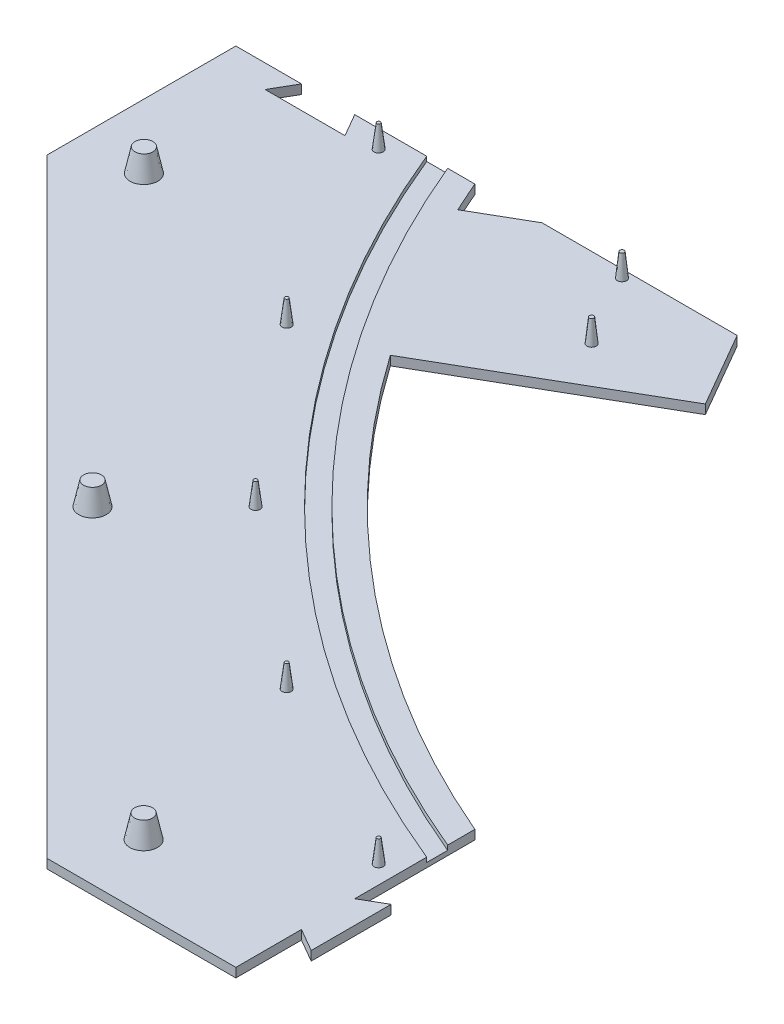
ISO-10303-21;
HEADER;
FILE_DESCRIPTION(('STEP AP214'),'2;1');
FILE_NAME('part.step','',(''),(''),'','','');
FILE_SCHEMA(('AUTOMOTIVE_DESIGN { 1 0 10303 214 1 1 1 1 }'));
ENDSEC;
DATA;
#1=APPLICATION_CONTEXT('core data for automotive mechanical design processes');
#2=APPLICATION_PROTOCOL_DEFINITION('international standard','automotive_design',2000,#1);
#3=PRODUCT_CONTEXT('',#1,'mechanical');
#4=PRODUCT('Part','Part','',(#3));
#5=PRODUCT_RELATED_PRODUCT_CATEGORY('part','',(#4));
#6=PRODUCT_DEFINITION_FORMATION('','',#4);
#7=PRODUCT_DEFINITION_CONTEXT('part definition',#1,'design');
#8=PRODUCT_DEFINITION('design','',#6,#7);
#9=PRODUCT_DEFINITION_SHAPE('','',#8);
#10=(LENGTH_UNIT() NAMED_UNIT(*) SI_UNIT(.MILLI.,.METRE.));
#11=(NAMED_UNIT(*) PLANE_ANGLE_UNIT() SI_UNIT($,.RADIAN.));
#12=(NAMED_UNIT(*) SI_UNIT($,.STERADIAN.) SOLID_ANGLE_UNIT());
#13=UNCERTAINTY_MEASURE_WITH_UNIT(LENGTH_MEASURE(1.E-05),#10,'distance_accuracy_value','');
#14=(GEOMETRIC_REPRESENTATION_CONTEXT(3) GLOBAL_UNCERTAINTY_ASSIGNED_CONTEXT((#13)) GLOBAL_UNIT_ASSIGNED_CONTEXT((#10,
#11,#12)) REPRESENTATION_CONTEXT('',''));
#15=CARTESIAN_POINT('',(0.,0.,0.));
#16=DIRECTION('',(0.,0.,1.));
#17=DIRECTION('',(1.,0.,0.));
#18=AXIS2_PLACEMENT_3D('',#15,#16,#17);
#19=CARTESIAN_POINT('',(0.,0.,0.));
#20=DIRECTION('',(0.,1.,0.));
#21=DIRECTION('',(0.,0.,1.));
#22=AXIS2_PLACEMENT_3D('',#19,#20,#21);
#23=PLANE('',#22);
#24=CARTESIAN_POINT('',(-169.571106160673,0.,108.294228634058));
#25=DIRECTION('',(0.,1.,0.));
#26=DIRECTION('',(0.866025403784443,0.,-0.499999999999992));
#27=AXIS2_PLACEMENT_3D('',#24,#25,#26);
#28=CIRCLE('',#27,1.);
#29=CARTESIAN_POINT('',(-168.705080756889,0.,107.794228634058));
#30=VERTEX_POINT('',#29);
#31=EDGE_CURVE('E317',#30,#30,#28,.T.);
#32=ORIENTED_EDGE('',*,*,#31,.F.);
#33=EDGE_LOOP('',(#32));
#34=FACE_BOUND('',#33,.T.);
#35=CARTESIAN_POINT('',(-178.571106160673,0.,92.7057713659384));
#36=DIRECTION('',(0.,1.,0.));
#37=DIRECTION('',(0.866025403784443,0.,-0.499999999999992));
#38=AXIS2_PLACEMENT_3D('',#35,#36,#37);
#39=CIRCLE('',#38,1.);
#40=CARTESIAN_POINT('',(-177.705080756889,0.,92.2057713659384));
#41=VERTEX_POINT('',#40);
#42=EDGE_CURVE('E309',#41,#41,#39,.T.);
#43=ORIENTED_EDGE('',*,*,#42,.F.);
#44=EDGE_LOOP('',(#43));
#45=FACE_BOUND('',#44,.T.);
#46=DIRECTION('',(-1.,0.,0.));
#47=VECTOR('',#46,1.);
#48=CARTESIAN_POINT('',(0.,0.,91.));
#49=LINE('',#48,#47);
#50=CARTESIAN_POINT('',(-212.176813059297,0.,91.));
#51=VERTEX_POINT('',#50);
#52=CARTESIAN_POINT('',(-218.074964175166,0.,91.));
#53=VERTEX_POINT('',#52);
#54=EDGE_CURVE('E411',#51,#53,#49,.T.);
#55=ORIENTED_EDGE('',*,*,#54,.T.);
#56=CARTESIAN_POINT('',(0.,0.,0.));
#57=DIRECTION('',(0.,1.,0.));
#58=DIRECTION('',(0.,0.,1.));
#59=AXIS2_PLACEMENT_3D('',#56,#57,#58);
#60=CIRCLE('',#59,236.3);
#61=CARTESIAN_POINT('',(-91.,0.,218.074964175166));
#62=VERTEX_POINT('',#61);
#63=EDGE_CURVE('E52',#53,#62,#60,.T.);
#64=ORIENTED_EDGE('',*,*,#63,.T.);
#65=DIRECTION('',(0.,0.,-1.));
#66=VECTOR('',#65,1.);
#67=CARTESIAN_POINT('',(-91.,0.,0.));
#68=LINE('',#67,#66);
#69=CARTESIAN_POINT('',(-91.,0.,212.176813059297));
#70=VERTEX_POINT('',#69);
#71=EDGE_CURVE('E396',#62,#70,#68,.T.);
#72=ORIENTED_EDGE('',*,*,#71,.T.);
#73=CARTESIAN_POINT('',(0.,0.,0.));
#74=DIRECTION('',(0.,1.,0.));
#75=DIRECTION('',(0.,0.,1.));
#76=AXIS2_PLACEMENT_3D('',#73,#74,#75);
#77=CIRCLE('',#76,230.867927612304);
#78=CARTESIAN_POINT('',(-189.185842870419,0.,132.320508075691));
#79=VERTEX_POINT('',#78);
#80=EDGE_CURVE('E346',#70,#79,#77,.F.);
#81=ORIENTED_EDGE('',*,*,#80,.T.);
#82=DIRECTION('',(0.866025403784433,0.,-0.50000000000001));
#83=VECTOR('',#82,1.);
#84=CARTESIAN_POINT('',(10.0000000000002,0.,17.3205080756886));
#85=LINE('',#84,#83);
#86=CARTESIAN_POINT('',(-145.884572681198,0.,107.32050807569));
#87=VERTEX_POINT('',#86);
#88=EDGE_CURVE('E369',#79,#87,#85,.T.);
#89=ORIENTED_EDGE('',*,*,#88,.T.);
#90=DIRECTION('',(-0.50000000000001,0.,-0.866025403784433));
#91=VECTOR('',#90,1.);
#92=CARTESIAN_POINT('',(-155.884572681198,0.,90.0000000000018));
#93=LINE('',#92,#91);
#94=CARTESIAN_POINT('',(-155.307222412009,0.,91.));
#95=VERTEX_POINT('',#94);
#96=EDGE_CURVE('E374',#87,#95,#93,.T.);
#97=ORIENTED_EDGE('',*,*,#96,.T.);
#98=CARTESIAN_POINT('',(-197.616623488763,0.,91.));
#99=VERTEX_POINT('',#98);
#100=EDGE_CURVE('E406',#95,#99,#49,.T.);
#101=ORIENTED_EDGE('',*,*,#100,.T.);
#102=DIRECTION('',(0.866025403784433,0.,-0.50000000000001));
#103=VECTOR('',#102,1.);
#104=CARTESIAN_POINT('',(-10.0000000000002,0.,-17.3205080756886));
#105=LINE('',#104,#103);
#106=CARTESIAN_POINT('',(-209.18584287042,0.,97.6794919243137));
#107=VERTEX_POINT('',#106);
#108=EDGE_CURVE('E378',#107,#99,#105,.T.);
#109=ORIENTED_EDGE('',*,*,#108,.F.);
#110=CARTESIAN_POINT('',(0.,0.,0.));
#111=DIRECTION('',(0.,1.,0.));
#112=DIRECTION('',(-0.866025403784443,0.,-0.499999999999992));
#113=AXIS2_PLACEMENT_3D('',#110,#111,#112);
#114=CIRCLE('',#113,230.867927612304);
#115=EDGE_CURVE('E352',#51,#107,#114,.T.);
#116=ORIENTED_EDGE('',*,*,#115,.F.);
#117=EDGE_LOOP('',(#55,#64,#72,#81,#89,#97,#101,#109,#116));
#118=FACE_BOUND('',#117,.T.);
#119=ADVANCED_FACE('F36',(#34,#45,#118),#23,.T.);
#120=CARTESIAN_POINT('',(-91.,8.,91.));
#121=DIRECTION('',(0.,0.,-1.));
#122=DIRECTION('',(-1.,0.,0.));
#123=AXIS2_PLACEMENT_3D('',#120,#121,#122);
#124=PLANE('',#123);
#125=DIRECTION('',(0.,1.,0.));
#126=VECTOR('',#125,1.);
#127=CARTESIAN_POINT('',(-249.773502691896,8.,91.));
#128=LINE('',#127,#126);
#129=CARTESIAN_POINT('',(-249.773502691896,-2.,90.9999999999999));
#130=VERTEX_POINT('',#129);
#131=CARTESIAN_POINT('',(-249.773502691896,0.,90.9999999999999));
#132=VERTEX_POINT('',#131);
#133=EDGE_CURVE('E200',#130,#132,#128,.T.);
#134=ORIENTED_EDGE('',*,*,#133,.F.);
#135=DIRECTION('',(1.,0.,0.));
#136=VECTOR('',#135,1.);
#137=CARTESIAN_POINT('',(-91.,-2.,91.));
#138=LINE('',#137,#136);
#139=CARTESIAN_POINT('',(-264.,-2.,91.));
#140=VERTEX_POINT('',#139);
#141=EDGE_CURVE('E416',#140,#130,#138,.T.);
#142=ORIENTED_EDGE('',*,*,#141,.F.);
#143=DIRECTION('',(0.,-1.,0.));
#144=VECTOR('',#143,1.);
#145=CARTESIAN_POINT('',(-264.,8.,91.));
#146=LINE('',#145,#144);
#147=CARTESIAN_POINT('',(-264.,0.,91.));
#148=VERTEX_POINT('',#147);
#149=EDGE_CURVE('E410',#148,#140,#146,.T.);
#150=ORIENTED_EDGE('',*,*,#149,.F.);
#151=EDGE_CURVE('E401',#132,#148,#49,.T.);
#152=ORIENTED_EDGE('',*,*,#151,.F.);
#153=EDGE_LOOP('',(#134,#142,#150,#152));
#154=FACE_BOUND('',#153,.T.);
#155=ADVANCED_FACE('F523',(#154),#124,.T.);
#156=CARTESIAN_POINT('',(-91.,8.,91.));
#157=DIRECTION('',(1.,0.,0.));
#158=DIRECTION('',(0.,0.,-1.));
#159=AXIS2_PLACEMENT_3D('',#156,#157,#158);
#160=PLANE('',#159);
#161=DIRECTION('',(0.,1.,0.));
#162=VECTOR('',#161,1.);
#163=CARTESIAN_POINT('',(-91.,-1.,222.619069264068));
#164=LINE('',#163,#162);
#165=CARTESIAN_POINT('',(-91.,0.,222.619069264068));
#166=VERTEX_POINT('',#165);
#167=CARTESIAN_POINT('',(-91.,-1.,222.619069264068));
#168=VERTEX_POINT('',#167);
#169=EDGE_CURVE('E476',#166,#168,#164,.F.);
#170=ORIENTED_EDGE('',*,*,#169,.F.);
#171=CARTESIAN_POINT('',(-91.,0.,238.226497308104));
#172=VERTEX_POINT('',#171);
#173=EDGE_CURVE('E395',#172,#166,#68,.T.);
#174=ORIENTED_EDGE('',*,*,#173,.F.);
#175=DIRECTION('',(0.,1.,0.));
#176=VECTOR('',#175,1.);
#177=CARTESIAN_POINT('',(-91.,8.,238.226497308104));
#178=LINE('',#177,#176);
#179=CARTESIAN_POINT('',(-91.,-2.,238.226497308104));
#180=VERTEX_POINT('',#179);
#181=EDGE_CURVE('E222',#180,#172,#178,.T.);
#182=ORIENTED_EDGE('',*,*,#181,.F.);
#183=DIRECTION('',(0.,0.,1.));
#184=VECTOR('',#183,1.);
#185=CARTESIAN_POINT('',(-91.,-2.,91.));
#186=LINE('',#185,#184);
#187=CARTESIAN_POINT('',(-91.,-2.,212.176813059297));
#188=VERTEX_POINT('',#187);
#189=EDGE_CURVE('E425',#188,#180,#186,.T.);
#190=ORIENTED_EDGE('',*,*,#189,.F.);
#191=DIRECTION('',(0.,1.,0.));
#192=VECTOR('',#191,1.);
#193=CARTESIAN_POINT('',(-91.,-2.,212.176813059297));
#194=LINE('',#193,#192);
#195=EDGE_CURVE('E229',#70,#188,#194,.F.);
#196=ORIENTED_EDGE('',*,*,#195,.F.);
#197=ORIENTED_EDGE('',*,*,#71,.F.);
#198=DIRECTION('',(0.,1.,0.));
#199=VECTOR('',#198,1.);
#200=CARTESIAN_POINT('',(-91.,-1.,218.074964175166));
#201=LINE('',#200,#199);
#202=CARTESIAN_POINT('',(-91.,-1.,218.074964175166));
#203=VERTEX_POINT('',#202);
#204=EDGE_CURVE('E491',#62,#203,#201,.F.);
#205=ORIENTED_EDGE('',*,*,#204,.T.);
#206=DIRECTION('',(0.,0.,1.));
#207=VECTOR('',#206,1.);
#208=CARTESIAN_POINT('',(-91.,-1.,91.));
#209=LINE('',#208,#207);
#210=EDGE_CURVE('E207',#203,#168,#209,.T.);
#211=ORIENTED_EDGE('',*,*,#210,.T.);
#212=EDGE_LOOP('',(#170,#174,#182,#190,#196,#197,#205,#211));
#213=FACE_BOUND('',#212,.T.);
#214=ADVANCED_FACE('F507',(#213),#160,.T.);
#215=CARTESIAN_POINT('',(0.,-2.,0.));
#216=DIRECTION('',(0.,1.,0.));
#217=DIRECTION('',(0.,0.,1.));
#218=AXIS2_PLACEMENT_3D('',#215,#216,#217);
#219=PLANE('',#218);
#220=ORIENTED_EDGE('',*,*,#141,.T.);
#221=DIRECTION('',(-0.5,0.,0.866025403784438));
#222=VECTOR('',#221,1.);
#223=CARTESIAN_POINT('',(-244.,-2.,81.));
#224=LINE('',#223,#222);
#225=CARTESIAN_POINT('',(-252.660254037844,-2.,96.));
#226=VERTEX_POINT('',#225);
#227=EDGE_CURVE('E468',#130,#226,#224,.T.);
#228=ORIENTED_EDGE('',*,*,#227,.T.);
#229=DIRECTION('',(1.,0.,0.));
#230=VECTOR('',#229,1.);
#231=CARTESIAN_POINT('',(-252.660254037844,-2.,96.));
#232=LINE('',#231,#230);
#233=CARTESIAN_POINT('',(-235.339745962156,-2.,96.));
#234=VERTEX_POINT('',#233);
#235=EDGE_CURVE('E480',#226,#234,#232,.T.);
#236=ORIENTED_EDGE('',*,*,#235,.T.);
#237=DIRECTION('',(-0.5,0.,-0.866025403784438));
#238=VECTOR('',#237,1.);
#239=CARTESIAN_POINT('',(-235.339745962156,-2.,96.));
#240=LINE('',#239,#238);
#241=CARTESIAN_POINT('',(-238.226497308104,-2.,90.9999999999999));
#242=VERTEX_POINT('',#241);
#243=EDGE_CURVE('E462',#234,#242,#240,.T.);
#244=ORIENTED_EDGE('',*,*,#243,.T.);
#245=CARTESIAN_POINT('',(-212.176813059297,-2.,91.));
#246=VERTEX_POINT('',#245);
#247=EDGE_CURVE('E423',#242,#246,#138,.T.);
#248=ORIENTED_EDGE('',*,*,#247,.T.);
#249=CARTESIAN_POINT('',(0.,-2.,0.));
#250=DIRECTION('',(0.,1.,0.));
#251=DIRECTION('',(-0.866025403784443,0.,-0.499999999999992));
#252=AXIS2_PLACEMENT_3D('',#249,#250,#251);
#253=CIRCLE('',#252,230.867927612304);
#254=CARTESIAN_POINT('',(-209.18584287042,-2.,97.6794919243137));
#255=VERTEX_POINT('',#254);
#256=EDGE_CURVE('E349',#246,#255,#253,.T.);
#257=ORIENTED_EDGE('',*,*,#256,.T.);
#258=DIRECTION('',(0.866025403784433,0.,-0.50000000000001));
#259=VECTOR('',#258,1.);
#260=CARTESIAN_POINT('',(-10.0000000000002,-2.,-17.3205080756886));
#261=LINE('',#260,#259);
#262=CARTESIAN_POINT('',(-197.616623488763,-2.,91.));
#263=VERTEX_POINT('',#262);
#264=EDGE_CURVE('E373',#255,#263,#261,.T.);
#265=ORIENTED_EDGE('',*,*,#264,.T.);
#266=CARTESIAN_POINT('',(-155.307222412009,-2.,91.));
#267=VERTEX_POINT('',#266);
#268=EDGE_CURVE('E424',#263,#267,#138,.T.);
#269=ORIENTED_EDGE('',*,*,#268,.T.);
#270=DIRECTION('',(-0.50000000000001,0.,-0.866025403784433));
#271=VECTOR('',#270,1.);
#272=CARTESIAN_POINT('',(-155.884572681198,-2.,90.0000000000018));
#273=LINE('',#272,#271);
#274=CARTESIAN_POINT('',(-145.884572681198,-2.,107.32050807569));
#275=VERTEX_POINT('',#274);
#276=EDGE_CURVE('E385',#275,#267,#273,.T.);
#277=ORIENTED_EDGE('',*,*,#276,.F.);
#278=DIRECTION('',(0.866025403784433,0.,-0.50000000000001));
#279=VECTOR('',#278,1.);
#280=CARTESIAN_POINT('',(10.0000000000002,-2.,17.3205080756886));
#281=LINE('',#280,#279);
#282=CARTESIAN_POINT('',(-189.185842870419,-2.,132.320508075691));
#283=VERTEX_POINT('',#282);
#284=EDGE_CURVE('E363',#283,#275,#281,.T.);
#285=ORIENTED_EDGE('',*,*,#284,.F.);
#286=CARTESIAN_POINT('',(0.,-2.,0.));
#287=DIRECTION('',(0.,1.,0.));
#288=DIRECTION('',(0.,0.,1.));
#289=AXIS2_PLACEMENT_3D('',#286,#287,#288);
#290=CIRCLE('',#289,230.867927612304);
#291=EDGE_CURVE('E345',#188,#283,#290,.F.);
#292=ORIENTED_EDGE('',*,*,#291,.F.);
#293=ORIENTED_EDGE('',*,*,#189,.T.);
#294=DIRECTION('',(0.866025403784439,0.,-0.5));
#295=VECTOR('',#294,1.);
#296=CARTESIAN_POINT('',(-86.,-2.,235.339745962156));
#297=LINE('',#296,#295);
#298=CARTESIAN_POINT('',(-86.,-2.,235.339745962156));
#299=VERTEX_POINT('',#298);
#300=EDGE_CURVE('E433',#180,#299,#297,.T.);
#301=ORIENTED_EDGE('',*,*,#300,.T.);
#302=DIRECTION('',(0.,0.,1.));
#303=VECTOR('',#302,1.);
#304=CARTESIAN_POINT('',(-86.,-2.,252.660254037844));
#305=LINE('',#304,#303);
#306=CARTESIAN_POINT('',(-86.,-2.,252.660254037844));
#307=VERTEX_POINT('',#306);
#308=EDGE_CURVE('E442',#299,#307,#305,.T.);
#309=ORIENTED_EDGE('',*,*,#308,.T.);
#310=DIRECTION('',(-0.866025403784438,0.,-0.500000000000001));
#311=VECTOR('',#310,1.);
#312=CARTESIAN_POINT('',(-101.,-2.,244.));
#313=LINE('',#312,#311);
#314=CARTESIAN_POINT('',(-91.,-2.,249.773502691896));
#315=VERTEX_POINT('',#314);
#316=EDGE_CURVE('E430',#307,#315,#313,.T.);
#317=ORIENTED_EDGE('',*,*,#316,.T.);
#318=CARTESIAN_POINT('',(-91.,-2.,264.));
#319=VERTEX_POINT('',#318);
#320=EDGE_CURVE('E429',#315,#319,#186,.T.);
#321=ORIENTED_EDGE('',*,*,#320,.T.);
#322=DIRECTION('',(1.,0.,0.));
#323=VECTOR('',#322,1.);
#324=CARTESIAN_POINT('',(-131.979594929244,-2.,264.));
#325=LINE('',#324,#323);
#326=CARTESIAN_POINT('',(-131.979594929244,-2.,264.));
#327=VERTEX_POINT('',#326);
#328=EDGE_CURVE('E241',#327,#319,#325,.T.);
#329=ORIENTED_EDGE('',*,*,#328,.F.);
#330=DIRECTION('',(0.707107865975289,0.,0.707105696396142));
#331=VECTOR('',#330,1.);
#332=CARTESIAN_POINT('',(-131.979594929244,-2.,264.));
#333=LINE('',#332,#331);
#334=CARTESIAN_POINT('',(-264.,-2.,131.98));
#335=VERTEX_POINT('',#334);
#336=EDGE_CURVE('E261',#335,#327,#333,.T.);
#337=ORIENTED_EDGE('',*,*,#336,.F.);
#338=DIRECTION('',(0.,0.,1.));
#339=VECTOR('',#338,1.);
#340=CARTESIAN_POINT('',(-264.,-2.,-131.979594929244));
#341=LINE('',#340,#339);
#342=EDGE_CURVE('E249',#140,#335,#341,.T.);
#343=ORIENTED_EDGE('',*,*,#342,.F.);
#344=EDGE_LOOP('',(#220,#228,#236,#244,#248,#257,#265,#269,#277,#285,#292,#293,#301,#309,#317,
#321,#329,#337,#343));
#345=FACE_BOUND('',#344,.T.);
#346=ADVANCED_FACE('F555',(#345),#219,.F.);
#347=CARTESIAN_POINT('',(0.,0.,0.));
#348=DIRECTION('',(0.,1.,0.));
#349=DIRECTION('',(0.,0.,1.));
#350=AXIS2_PLACEMENT_3D('',#347,#348,#349);
#351=CIRCLE('',#350,240.5);
#352=CARTESIAN_POINT('',(-222.619069264068,0.,91.));
#353=VERTEX_POINT('',#352);
#354=EDGE_CURVE('E209',#353,#166,#351,.T.);
#355=ORIENTED_EDGE('',*,*,#354,.F.);
#356=CARTESIAN_POINT('',(-238.226497308104,0.,91.));
#357=VERTEX_POINT('',#356);
#358=EDGE_CURVE('E60',#353,#357,#49,.T.);
#359=ORIENTED_EDGE('',*,*,#358,.T.);
#360=DIRECTION('',(-0.5,0.,-0.866025403784438));
#361=VECTOR('',#360,1.);
#362=CARTESIAN_POINT('',(-235.339745962156,0.,96.));
#363=LINE('',#362,#361);
#364=CARTESIAN_POINT('',(-235.339745962156,0.,96.));
#365=VERTEX_POINT('',#364);
#366=EDGE_CURVE('E465',#365,#357,#363,.T.);
#367=ORIENTED_EDGE('',*,*,#366,.F.);
#368=DIRECTION('',(1.,0.,0.));
#369=VECTOR('',#368,1.);
#370=CARTESIAN_POINT('',(-252.660254037844,0.,96.));
#371=LINE('',#370,#369);
#372=CARTESIAN_POINT('',(-252.660254037844,0.,96.));
#373=VERTEX_POINT('',#372);
#374=EDGE_CURVE('E469',#373,#365,#371,.T.);
#375=ORIENTED_EDGE('',*,*,#374,.F.);
#376=DIRECTION('',(-0.5,0.,0.866025403784438));
#377=VECTOR('',#376,1.);
#378=CARTESIAN_POINT('',(-244.,0.,81.));
#379=LINE('',#378,#377);
#380=EDGE_CURVE('E473',#132,#373,#379,.T.);
#381=ORIENTED_EDGE('',*,*,#380,.F.);
#382=ORIENTED_EDGE('',*,*,#151,.T.);
#383=DIRECTION('',(0.,0.,1.));
#384=VECTOR('',#383,1.);
#385=CARTESIAN_POINT('',(-264.,0.,0.));
#386=LINE('',#385,#384);
#387=CARTESIAN_POINT('',(-264.,0.,131.98));
#388=VERTEX_POINT('',#387);
#389=EDGE_CURVE('E254',#148,#388,#386,.T.);
#390=ORIENTED_EDGE('',*,*,#389,.T.);
#391=DIRECTION('',(0.707107865975289,0.,0.707105696396142));
#392=VECTOR('',#391,1.);
#393=CARTESIAN_POINT('',(-131.979594929244,0.,264.));
#394=LINE('',#393,#392);
#395=CARTESIAN_POINT('',(-131.979594929244,0.,264.));
#396=VERTEX_POINT('',#395);
#397=EDGE_CURVE('E250',#388,#396,#394,.T.);
#398=ORIENTED_EDGE('',*,*,#397,.T.);
#399=DIRECTION('',(1.,0.,0.));
#400=VECTOR('',#399,1.);
#401=CARTESIAN_POINT('',(0.,0.,264.));
#402=LINE('',#401,#400);
#403=CARTESIAN_POINT('',(-91.,0.,264.));
#404=VERTEX_POINT('',#403);
#405=EDGE_CURVE('E245',#396,#404,#402,.T.);
#406=ORIENTED_EDGE('',*,*,#405,.T.);
#407=CARTESIAN_POINT('',(-91.,0.,249.773502691896));
#408=VERTEX_POINT('',#407);
#409=EDGE_CURVE('E382',#404,#408,#68,.T.);
#410=ORIENTED_EDGE('',*,*,#409,.T.);
#411=DIRECTION('',(0.866025403784438,0.,0.500000000000001));
#412=VECTOR('',#411,1.);
#413=CARTESIAN_POINT('',(-101.,0.,244.));
#414=LINE('',#413,#412);
#415=CARTESIAN_POINT('',(-86.,0.,252.660254037844));
#416=VERTEX_POINT('',#415);
#417=EDGE_CURVE('E446',#408,#416,#414,.T.);
#418=ORIENTED_EDGE('',*,*,#417,.T.);
#419=DIRECTION('',(0.,0.,-1.));
#420=VECTOR('',#419,1.);
#421=CARTESIAN_POINT('',(-86.,0.,252.660254037844));
#422=LINE('',#421,#420);
#423=CARTESIAN_POINT('',(-86.,0.,235.339745962156));
#424=VERTEX_POINT('',#423);
#425=EDGE_CURVE('E439',#416,#424,#422,.T.);
#426=ORIENTED_EDGE('',*,*,#425,.T.);
#427=DIRECTION('',(-0.866025403784439,0.,0.5));
#428=VECTOR('',#427,1.);
#429=CARTESIAN_POINT('',(-86.,0.,235.339745962156));
#430=LINE('',#429,#428);
#431=EDGE_CURVE('E449',#424,#172,#430,.T.);
#432=ORIENTED_EDGE('',*,*,#431,.T.);
#433=ORIENTED_EDGE('',*,*,#173,.T.);
#434=EDGE_LOOP('',(#355,#359,#367,#375,#381,#382,#390,#398,#406,#410,#418,#426,#432,#433));
#435=FACE_BOUND('',#434,.T.);
#436=CARTESIAN_POINT('',(-94.905491226544,0.,229.122124062798));
#437=DIRECTION('',(0.,1.,0.));
#438=DIRECTION('',(0.382683432365097,0.,-0.923879532511284));
#439=AXIS2_PLACEMENT_3D('',#436,#437,#438);
#440=CIRCLE('',#439,1.);
#441=CARTESIAN_POINT('',(-94.5228077941789,0.,228.198244530287));
#442=VERTEX_POINT('',#441);
#443=EDGE_CURVE('E270',#442,#442,#440,.T.);
#444=ORIENTED_EDGE('',*,*,#443,.F.);
#445=EDGE_LOOP('',(#444));
#446=FACE_BOUND('',#445,.T.);
#447=CARTESIAN_POINT('',(-137.781417788863,0.,206.20446385103));
#448=DIRECTION('',(0.,1.,0.));
#449=DIRECTION('',(0.555570233019609,0.,-0.831469612302541));
#450=AXIS2_PLACEMENT_3D('',#447,#448,#449);
#451=CIRCLE('',#450,1.);
#452=CARTESIAN_POINT('',(-137.225847555843,0.,205.372994238728));
#453=VERTEX_POINT('',#452);
#454=EDGE_CURVE('E278',#453,#453,#451,.T.);
#455=ORIENTED_EDGE('',*,*,#454,.F.);
#456=EDGE_LOOP('',(#455));
#457=FACE_BOUND('',#456,.T.);
#458=CARTESIAN_POINT('',(-175.362481734265,0.,175.362481734262));
#459=DIRECTION('',(0.,1.,0.));
#460=DIRECTION('',(0.707106781186554,0.,-0.707106781186541));
#461=AXIS2_PLACEMENT_3D('',#458,#459,#460);
#462=CIRCLE('',#461,1.);
#463=CARTESIAN_POINT('',(-174.655374953079,0.,174.655374953076));
#464=VERTEX_POINT('',#463);
#465=EDGE_CURVE('E286',#464,#464,#462,.T.);
#466=ORIENTED_EDGE('',*,*,#465,.F.);
#467=EDGE_LOOP('',(#466));
#468=FACE_BOUND('',#467,.T.);
#469=CARTESIAN_POINT('',(-206.204463851032,0.,137.78141778886));
#470=DIRECTION('',(0.,1.,0.));
#471=DIRECTION('',(0.83146961230255,0.,-0.555570233019595));
#472=AXIS2_PLACEMENT_3D('',#469,#470,#471);
#473=CIRCLE('',#472,1.);
#474=CARTESIAN_POINT('',(-205.37299423873,0.,137.22584755584));
#475=VERTEX_POINT('',#474);
#476=EDGE_CURVE('E294',#475,#475,#473,.T.);
#477=ORIENTED_EDGE('',*,*,#476,.F.);
#478=EDGE_LOOP('',(#477));
#479=FACE_BOUND('',#478,.T.);
#480=CARTESIAN_POINT('',(-229.1221240628,0.,94.9054912265401));
#481=DIRECTION('',(0.,1.,0.));
#482=DIRECTION('',(0.923879532511291,0.,-0.382683432365081));
#483=AXIS2_PLACEMENT_3D('',#480,#481,#482);
#484=CIRCLE('',#483,1.);
#485=CARTESIAN_POINT('',(-228.198244530289,0.,94.522807794175));
#486=VERTEX_POINT('',#485);
#487=EDGE_CURVE('E302',#486,#486,#484,.T.);
#488=ORIENTED_EDGE('',*,*,#487,.F.);
#489=EDGE_LOOP('',(#488));
#490=FACE_BOUND('',#489,.T.);
#491=CARTESIAN_POINT('',(-193.04015126393,0.,193.040151263925));
#492=DIRECTION('',(0.,1.,0.));
#493=DIRECTION('',(1.,0.,0.));
#494=AXIS2_PLACEMENT_3D('',#491,#492,#493);
#495=CIRCLE('',#494,2.99999999999999);
#496=CARTESIAN_POINT('',(-190.04015126393,0.,193.040151263925));
#497=VERTEX_POINT('',#496);
#498=EDGE_CURVE('E325',#497,#497,#495,.T.);
#499=ORIENTED_EDGE('',*,*,#498,.F.);
#500=EDGE_LOOP('',(#499));
#501=FACE_BOUND('',#500,.T.);
#502=CARTESIAN_POINT('',(-125.,0.,250.));
#503=DIRECTION('',(0.,1.,0.));
#504=DIRECTION('',(0.,0.,1.));
#505=AXIS2_PLACEMENT_3D('',#502,#503,#504);
#506=CIRCLE('',#505,2.99999999999999);
#507=CARTESIAN_POINT('',(-125.,0.,253.));
#508=VERTEX_POINT('',#507);
#509=EDGE_CURVE('E333',#508,#508,#506,.T.);
#510=ORIENTED_EDGE('',*,*,#509,.F.);
#511=EDGE_LOOP('',(#510));
#512=FACE_BOUND('',#511,.T.);
#513=CARTESIAN_POINT('',(-250.065638642357,0.,124.868636456037));
#514=DIRECTION('',(0.,1.,0.));
#515=DIRECTION('',(-0.600420225325885,0.,0.79968465848709));
#516=AXIS2_PLACEMENT_3D('',#513,#514,#515);
#517=CIRCLE('',#516,2.99999999999999);
#518=CARTESIAN_POINT('',(-251.866899318335,0.,127.267690431498));
#519=VERTEX_POINT('',#518);
#520=EDGE_CURVE('E341',#519,#519,#517,.T.);
#521=ORIENTED_EDGE('',*,*,#520,.F.);
#522=EDGE_LOOP('',(#521));
#523=FACE_BOUND('',#522,.T.);
#524=ADVANCED_FACE('F517',(#435,#446,#457,#468,#479,#490,#501,#512,#523),#23,.T.);
#525=CARTESIAN_POINT('',(0.,-2.,264.));
#526=DIRECTION('',(0.,0.,1.));
#527=DIRECTION('',(1.,0.,0.));
#528=AXIS2_PLACEMENT_3D('',#525,#526,#527);
#529=PLANE('',#528);
#530=ORIENTED_EDGE('',*,*,#328,.T.);
#531=DIRECTION('',(0.,-1.,0.));
#532=VECTOR('',#531,1.);
#533=CARTESIAN_POINT('',(-91.,8.,264.));
#534=LINE('',#533,#532);
#535=EDGE_CURVE('E412',#404,#319,#534,.T.);
#536=ORIENTED_EDGE('',*,*,#535,.F.);
#537=ORIENTED_EDGE('',*,*,#405,.F.);
#538=DIRECTION('',(0.,1.,0.));
#539=VECTOR('',#538,1.);
#540=CARTESIAN_POINT('',(-131.979594929244,-2.,264.));
#541=LINE('',#540,#539);
#542=EDGE_CURVE('E236',#327,#396,#541,.T.);
#543=ORIENTED_EDGE('',*,*,#542,.F.);
#544=EDGE_LOOP('',(#530,#536,#537,#543));
#545=FACE_BOUND('',#544,.T.);
#546=ADVANCED_FACE('F533',(#545),#529,.T.);
#547=CARTESIAN_POINT('',(-264.,-2.,0.));
#548=DIRECTION('',(-1.,0.,0.));
#549=DIRECTION('',(0.,0.,1.));
#550=AXIS2_PLACEMENT_3D('',#547,#548,#549);
#551=PLANE('',#550);
#552=ORIENTED_EDGE('',*,*,#389,.F.);
#553=ORIENTED_EDGE('',*,*,#149,.T.);
#554=ORIENTED_EDGE('',*,*,#342,.T.);
#555=DIRECTION('',(0.,1.,0.));
#556=VECTOR('',#555,1.);
#557=CARTESIAN_POINT('',(-264.,-2.,131.98));
#558=LINE('',#557,#556);
#559=EDGE_CURVE('E237',#335,#388,#558,.T.);
#560=ORIENTED_EDGE('',*,*,#559,.T.);
#561=EDGE_LOOP('',(#552,#553,#554,#560));
#562=FACE_BOUND('',#561,.T.);
#563=ADVANCED_FACE('F38',(#562),#551,.T.);
#564=CARTESIAN_POINT('',(0.,-2.,0.));
#565=DIRECTION('',(0.,1.,0.));
#566=DIRECTION('',(0.,0.,1.));
#567=AXIS2_PLACEMENT_3D('',#564,#565,#566);
#568=CYLINDRICAL_SURFACE('',#567,230.867927612304);
#569=ORIENTED_EDGE('',*,*,#80,.F.);
#570=ORIENTED_EDGE('',*,*,#195,.T.);
#571=ORIENTED_EDGE('',*,*,#291,.T.);
#572=DIRECTION('',(0.,1.,0.));
#573=VECTOR('',#572,1.);
#574=CARTESIAN_POINT('',(-189.185842870419,-2.,132.320508075691));
#575=LINE('',#574,#573);
#576=EDGE_CURVE('E355',#283,#79,#575,.T.);
#577=ORIENTED_EDGE('',*,*,#576,.T.);
#578=EDGE_LOOP('',(#569,#570,#571,#577));
#579=FACE_BOUND('',#578,.T.);
#580=ADVANCED_FACE('F560',(#579),#568,.F.);
#581=CARTESIAN_POINT('',(0.,-2.,0.));
#582=DIRECTION('',(0.,1.,0.));
#583=DIRECTION('',(0.,0.,1.));
#584=AXIS2_PLACEMENT_3D('',#581,#582,#583);
#585=CYLINDRICAL_SURFACE('',#584,230.867927612304);
#586=DIRECTION('',(0.,1.,0.));
#587=VECTOR('',#586,1.);
#588=CARTESIAN_POINT('',(-212.176813059297,-2.,91.));
#589=LINE('',#588,#587);
#590=EDGE_CURVE('E397',#51,#246,#589,.F.);
#591=ORIENTED_EDGE('',*,*,#590,.F.);
#592=ORIENTED_EDGE('',*,*,#115,.T.);
#593=DIRECTION('',(0.,1.,0.));
#594=VECTOR('',#593,1.);
#595=CARTESIAN_POINT('',(-209.18584287042,-2.,97.6794919243137));
#596=LINE('',#595,#594);
#597=EDGE_CURVE('E358',#255,#107,#596,.T.);
#598=ORIENTED_EDGE('',*,*,#597,.F.);
#599=ORIENTED_EDGE('',*,*,#256,.F.);
#600=EDGE_LOOP('',(#591,#592,#598,#599));
#601=FACE_BOUND('',#600,.T.);
#602=ADVANCED_FACE('F582',(#601),#585,.F.);
#603=CARTESIAN_POINT('',(-155.884572681198,-2.,90.0000000000018));
#604=DIRECTION('',(0.866025403784433,0.,-0.50000000000001));
#605=DIRECTION('',(-0.50000000000001,0.,-0.866025403784433));
#606=AXIS2_PLACEMENT_3D('',#603,#604,#605);
#607=PLANE('',#606);
#608=ORIENTED_EDGE('',*,*,#276,.T.);
#609=DIRECTION('',(0.,1.,0.));
#610=VECTOR('',#609,1.);
#611=CARTESIAN_POINT('',(-155.307222412009,-2.,91.));
#612=LINE('',#611,#610);
#613=EDGE_CURVE('E402',#267,#95,#612,.T.);
#614=ORIENTED_EDGE('',*,*,#613,.T.);
#615=ORIENTED_EDGE('',*,*,#96,.F.);
#616=DIRECTION('',(0.,1.,0.));
#617=VECTOR('',#616,1.);
#618=CARTESIAN_POINT('',(-145.884572681198,-2.,107.32050807569));
#619=LINE('',#618,#617);
#620=EDGE_CURVE('E362',#275,#87,#619,.T.);
#621=ORIENTED_EDGE('',*,*,#620,.F.);
#622=EDGE_LOOP('',(#608,#614,#615,#621));
#623=FACE_BOUND('',#622,.T.);
#624=ADVANCED_FACE('F568',(#623),#607,.T.);
#625=CARTESIAN_POINT('',(-10.0000000000002,-2.,-17.3205080756886));
#626=DIRECTION('',(0.50000000000001,0.,0.866025403784433));
#627=DIRECTION('',(0.866025403784433,0.,-0.50000000000001));
#628=AXIS2_PLACEMENT_3D('',#625,#626,#627);
#629=PLANE('',#628);
#630=DIRECTION('',(0.,1.,0.));
#631=VECTOR('',#630,1.);
#632=CARTESIAN_POINT('',(-197.616623488763,-2.,91.));
#633=LINE('',#632,#631);
#634=EDGE_CURVE('E233',#263,#99,#633,.T.);
#635=ORIENTED_EDGE('',*,*,#634,.F.);
#636=ORIENTED_EDGE('',*,*,#264,.F.);
#637=ORIENTED_EDGE('',*,*,#597,.T.);
#638=ORIENTED_EDGE('',*,*,#108,.T.);
#639=EDGE_LOOP('',(#635,#636,#637,#638));
#640=FACE_BOUND('',#639,.T.);
#641=ADVANCED_FACE('F584',(#640),#629,.F.);
#642=CARTESIAN_POINT('',(-131.979594929244,-2.,264.));
#643=DIRECTION('',(-0.707105696396142,0.,0.707107865975289));
#644=DIRECTION('',(0.707107865975289,0.,0.707105696396142));
#645=AXIS2_PLACEMENT_3D('',#642,#643,#644);
#646=PLANE('',#645);
#647=ORIENTED_EDGE('',*,*,#397,.F.);
#648=ORIENTED_EDGE('',*,*,#559,.F.);
#649=ORIENTED_EDGE('',*,*,#336,.T.);
#650=ORIENTED_EDGE('',*,*,#542,.T.);
#651=EDGE_LOOP('',(#647,#648,#649,#650));
#652=FACE_BOUND('',#651,.T.);
#653=ADVANCED_FACE('F530',(#652),#646,.T.);
#654=CARTESIAN_POINT('',(-94.905491226544,0.,229.122124062798));
#655=DIRECTION('',(0.,-1.,0.));
#656=DIRECTION('',(0.382683432365097,0.,-0.923879532511284));
#657=AXIS2_PLACEMENT_3D('',#654,#655,#656);
#658=CONICAL_SURFACE('',#657,1.,0.122173047639603);
#659=CARTESIAN_POINT('',(-94.905491226544,5.,229.122124062798));
#660=DIRECTION('',(0.,1.,0.));
#661=DIRECTION('',(0.,0.,1.));
#662=AXIS2_PLACEMENT_3D('',#659,#660,#661);
#663=CIRCLE('',#662,0.386077195485477);
#664=CARTESIAN_POINT('',(-94.905491226544,5.,229.508201258284));
#665=VERTEX_POINT('',#664);
#666=EDGE_CURVE('E257',#665,#665,#663,.T.);
#667=ORIENTED_EDGE('',*,*,#666,.F.);
#668=EDGE_LOOP('',(#667));
#669=FACE_BOUND('',#668,.T.);
#670=ORIENTED_EDGE('',*,*,#443,.T.);
#671=EDGE_LOOP('',(#670));
#672=FACE_BOUND('',#671,.T.);
#673=ADVANCED_FACE('F591',(#669,#672),#658,.T.);
#674=CARTESIAN_POINT('',(-94.905491226544,5.,229.122124062798));
#675=DIRECTION('',(0.,1.,0.));
#676=DIRECTION('',(0.382683432365097,0.,-0.923879532511284));
#677=AXIS2_PLACEMENT_3D('',#674,#675,#676);
#678=PLANE('',#677);
#679=ORIENTED_EDGE('',*,*,#666,.T.);
#680=EDGE_LOOP('',(#679));
#681=FACE_BOUND('',#680,.T.);
#682=ADVANCED_FACE('F617',(#681),#678,.T.);
#683=CARTESIAN_POINT('',(-137.781417788863,0.,206.20446385103));
#684=DIRECTION('',(0.,-1.,0.));
#685=DIRECTION('',(0.555570233019609,0.,-0.831469612302541));
#686=AXIS2_PLACEMENT_3D('',#683,#684,#685);
#687=CONICAL_SURFACE('',#686,1.,0.122173047639603);
#688=CARTESIAN_POINT('',(-137.781417788863,5.,206.20446385103));
#689=DIRECTION('',(0.,1.,0.));
#690=DIRECTION('',(0.,0.,1.));
#691=AXIS2_PLACEMENT_3D('',#688,#689,#690);
#692=CIRCLE('',#691,0.386077195485477);
#693=CARTESIAN_POINT('',(-137.781417788863,5.,206.590541046516));
#694=VERTEX_POINT('',#693);
#695=EDGE_CURVE('E274',#694,#694,#692,.T.);
#696=ORIENTED_EDGE('',*,*,#695,.F.);
#697=EDGE_LOOP('',(#696));
#698=FACE_BOUND('',#697,.T.);
#699=ORIENTED_EDGE('',*,*,#454,.T.);
#700=EDGE_LOOP('',(#699));
#701=FACE_BOUND('',#700,.T.);
#702=ADVANCED_FACE('F621',(#698,#701),#687,.T.);
#703=CARTESIAN_POINT('',(-137.781417788863,5.,206.20446385103));
#704=DIRECTION('',(0.,1.,0.));
#705=DIRECTION('',(0.555570233019609,0.,-0.831469612302541));
#706=AXIS2_PLACEMENT_3D('',#703,#704,#705);
#707=PLANE('',#706);
#708=ORIENTED_EDGE('',*,*,#695,.T.);
#709=EDGE_LOOP('',(#708));
#710=FACE_BOUND('',#709,.T.);
#711=ADVANCED_FACE('F625',(#710),#707,.T.);
#712=CARTESIAN_POINT('',(-175.362481734265,0.,175.362481734262));
#713=DIRECTION('',(0.,-1.,0.));
#714=DIRECTION('',(0.707106781186554,0.,-0.707106781186541));
#715=AXIS2_PLACEMENT_3D('',#712,#713,#714);
#716=CONICAL_SURFACE('',#715,1.,0.122173047639603);
#717=CARTESIAN_POINT('',(-175.362481734265,5.,175.362481734262));
#718=DIRECTION('',(0.,1.,0.));
#719=DIRECTION('',(0.,0.,1.));
#720=AXIS2_PLACEMENT_3D('',#717,#718,#719);
#721=CIRCLE('',#720,0.386077195485477);
#722=CARTESIAN_POINT('',(-175.362481734265,5.,175.748558929748));
#723=VERTEX_POINT('',#722);
#724=EDGE_CURVE('E282',#723,#723,#721,.T.);
#725=ORIENTED_EDGE('',*,*,#724,.F.);
#726=EDGE_LOOP('',(#725));
#727=FACE_BOUND('',#726,.T.);
#728=ORIENTED_EDGE('',*,*,#465,.T.);
#729=EDGE_LOOP('',(#728));
#730=FACE_BOUND('',#729,.T.);
#731=ADVANCED_FACE('F629',(#727,#730),#716,.T.);
#732=CARTESIAN_POINT('',(-175.362481734265,5.,175.362481734262));
#733=DIRECTION('',(0.,1.,0.));
#734=DIRECTION('',(0.707106781186554,0.,-0.707106781186541));
#735=AXIS2_PLACEMENT_3D('',#732,#733,#734);
#736=PLANE('',#735);
#737=ORIENTED_EDGE('',*,*,#724,.T.);
#738=EDGE_LOOP('',(#737));
#739=FACE_BOUND('',#738,.T.);
#740=ADVANCED_FACE('F633',(#739),#736,.T.);
#741=CARTESIAN_POINT('',(-206.204463851032,0.,137.78141778886));
#742=DIRECTION('',(0.,-1.,0.));
#743=DIRECTION('',(0.83146961230255,0.,-0.555570233019595));
#744=AXIS2_PLACEMENT_3D('',#741,#742,#743);
#745=CONICAL_SURFACE('',#744,1.,0.122173047639603);
#746=CARTESIAN_POINT('',(-206.204463851032,5.,137.78141778886));
#747=DIRECTION('',(0.,1.,0.));
#748=DIRECTION('',(0.,0.,1.));
#749=AXIS2_PLACEMENT_3D('',#746,#747,#748);
#750=CIRCLE('',#749,0.386077195485477);
#751=CARTESIAN_POINT('',(-206.204463851032,5.,138.167494984345));
#752=VERTEX_POINT('',#751);
#753=EDGE_CURVE('E290',#752,#752,#750,.T.);
#754=ORIENTED_EDGE('',*,*,#753,.F.);
#755=EDGE_LOOP('',(#754));
#756=FACE_BOUND('',#755,.T.);
#757=ORIENTED_EDGE('',*,*,#476,.T.);
#758=EDGE_LOOP('',(#757));
#759=FACE_BOUND('',#758,.T.);
#760=ADVANCED_FACE('F637',(#756,#759),#745,.T.);
#761=CARTESIAN_POINT('',(-206.204463851032,5.,137.78141778886));
#762=DIRECTION('',(0.,1.,0.));
#763=DIRECTION('',(0.83146961230255,0.,-0.555570233019595));
#764=AXIS2_PLACEMENT_3D('',#761,#762,#763);
#765=PLANE('',#764);
#766=ORIENTED_EDGE('',*,*,#753,.T.);
#767=EDGE_LOOP('',(#766));
#768=FACE_BOUND('',#767,.T.);
#769=ADVANCED_FACE('F641',(#768),#765,.T.);
#770=CARTESIAN_POINT('',(-229.1221240628,0.,94.9054912265401));
#771=DIRECTION('',(0.,-1.,0.));
#772=DIRECTION('',(0.923879532511291,0.,-0.382683432365081));
#773=AXIS2_PLACEMENT_3D('',#770,#771,#772);
#774=CONICAL_SURFACE('',#773,1.,0.122173047639603);
#775=CARTESIAN_POINT('',(-229.1221240628,5.,94.9054912265401));
#776=DIRECTION('',(0.,1.,0.));
#777=DIRECTION('',(0.,0.,1.));
#778=AXIS2_PLACEMENT_3D('',#775,#776,#777);
#779=CIRCLE('',#778,0.386077195485477);
#780=CARTESIAN_POINT('',(-229.1221240628,5.,95.2915684220255));
#781=VERTEX_POINT('',#780);
#782=EDGE_CURVE('E298',#781,#781,#779,.T.);
#783=ORIENTED_EDGE('',*,*,#782,.F.);
#784=EDGE_LOOP('',(#783));
#785=FACE_BOUND('',#784,.T.);
#786=ORIENTED_EDGE('',*,*,#487,.T.);
#787=EDGE_LOOP('',(#786));
#788=FACE_BOUND('',#787,.T.);
#789=ADVANCED_FACE('F645',(#785,#788),#774,.T.);
#790=CARTESIAN_POINT('',(-229.1221240628,5.,94.9054912265401));
#791=DIRECTION('',(0.,1.,0.));
#792=DIRECTION('',(0.923879532511291,0.,-0.382683432365081));
#793=AXIS2_PLACEMENT_3D('',#790,#791,#792);
#794=PLANE('',#793);
#795=ORIENTED_EDGE('',*,*,#782,.T.);
#796=EDGE_LOOP('',(#795));
#797=FACE_BOUND('',#796,.T.);
#798=ADVANCED_FACE('F649',(#797),#794,.T.);
#799=CARTESIAN_POINT('',(-178.571106160673,0.,92.7057713659384));
#800=DIRECTION('',(0.,-1.,0.));
#801=DIRECTION('',(0.866025403784443,0.,-0.499999999999992));
#802=AXIS2_PLACEMENT_3D('',#799,#800,#801);
#803=CONICAL_SURFACE('',#802,1.,0.10471975511966);
#804=CARTESIAN_POINT('',(-178.571106160673,5.,92.7057713659384));
#805=DIRECTION('',(0.,1.,0.));
#806=DIRECTION('',(0.,0.,1.));
#807=AXIS2_PLACEMENT_3D('',#804,#805,#806);
#808=CIRCLE('',#807,0.474478823671619);
#809=CARTESIAN_POINT('',(-178.571106160673,5.,93.18025018961));
#810=VERTEX_POINT('',#809);
#811=EDGE_CURVE('E306',#810,#810,#808,.T.);
#812=ORIENTED_EDGE('',*,*,#811,.F.);
#813=EDGE_LOOP('',(#812));
#814=FACE_BOUND('',#813,.T.);
#815=ORIENTED_EDGE('',*,*,#42,.T.);
#816=EDGE_LOOP('',(#815));
#817=FACE_BOUND('',#816,.T.);
#818=ADVANCED_FACE('F653',(#814,#817),#803,.T.);
#819=CARTESIAN_POINT('',(-178.571106160673,5.,92.7057713659384));
#820=DIRECTION('',(0.,1.,0.));
#821=DIRECTION('',(0.866025403784443,0.,-0.499999999999992));
#822=AXIS2_PLACEMENT_3D('',#819,#820,#821);
#823=PLANE('',#822);
#824=ORIENTED_EDGE('',*,*,#811,.T.);
#825=EDGE_LOOP('',(#824));
#826=FACE_BOUND('',#825,.T.);
#827=ADVANCED_FACE('F657',(#826),#823,.T.);
#828=CARTESIAN_POINT('',(-169.571106160673,0.,108.294228634058));
#829=DIRECTION('',(0.,-1.,0.));
#830=DIRECTION('',(0.866025403784443,0.,-0.499999999999992));
#831=AXIS2_PLACEMENT_3D('',#828,#829,#830);
#832=CONICAL_SURFACE('',#831,1.,0.10471975511966);
#833=CARTESIAN_POINT('',(-169.571106160673,5.,108.294228634058));
#834=DIRECTION('',(0.,1.,0.));
#835=DIRECTION('',(0.,0.,1.));
#836=AXIS2_PLACEMENT_3D('',#833,#834,#835);
#837=CIRCLE('',#836,0.474478823671619);
#838=CARTESIAN_POINT('',(-169.571106160673,5.,108.76870745773));
#839=VERTEX_POINT('',#838);
#840=EDGE_CURVE('E313',#839,#839,#837,.T.);
#841=ORIENTED_EDGE('',*,*,#840,.F.);
#842=EDGE_LOOP('',(#841));
#843=FACE_BOUND('',#842,.T.);
#844=ORIENTED_EDGE('',*,*,#31,.T.);
#845=EDGE_LOOP('',(#844));
#846=FACE_BOUND('',#845,.T.);
#847=ADVANCED_FACE('F661',(#843,#846),#832,.T.);
#848=CARTESIAN_POINT('',(-169.571106160673,5.,108.294228634058));
#849=DIRECTION('',(0.,1.,0.));
#850=DIRECTION('',(0.866025403784443,0.,-0.499999999999992));
#851=AXIS2_PLACEMENT_3D('',#848,#849,#850);
#852=PLANE('',#851);
#853=ORIENTED_EDGE('',*,*,#840,.T.);
#854=EDGE_LOOP('',(#853));
#855=FACE_BOUND('',#854,.T.);
#856=ADVANCED_FACE('F665',(#855),#852,.T.);
#857=CARTESIAN_POINT('',(-193.04015126393,0.,193.040151263925));
#858=DIRECTION('',(0.,-1.,0.));
#859=DIRECTION('',(1.,0.,0.));
#860=AXIS2_PLACEMENT_3D('',#857,#858,#859);
#861=CONICAL_SURFACE('',#860,2.99999999999999,0.20943951023932);
#862=CARTESIAN_POINT('',(-193.04015126393,5.,193.040151263925));
#863=DIRECTION('',(0.,1.,0.));
#864=DIRECTION('',(0.,0.,1.));
#865=AXIS2_PLACEMENT_3D('',#862,#863,#864);
#866=CIRCLE('',#865,1.93721719164988);
#867=CARTESIAN_POINT('',(-193.04015126393,5.,194.977368455575));
#868=VERTEX_POINT('',#867);
#869=EDGE_CURVE('E321',#868,#868,#866,.T.);
#870=ORIENTED_EDGE('',*,*,#869,.F.);
#871=EDGE_LOOP('',(#870));
#872=FACE_BOUND('',#871,.T.);
#873=ORIENTED_EDGE('',*,*,#498,.T.);
#874=EDGE_LOOP('',(#873));
#875=FACE_BOUND('',#874,.T.);
#876=ADVANCED_FACE('F669',(#872,#875),#861,.T.);
#877=CARTESIAN_POINT('',(-193.04015126393,5.,193.040151263925));
#878=DIRECTION('',(0.,1.,0.));
#879=DIRECTION('',(1.,0.,0.));
#880=AXIS2_PLACEMENT_3D('',#877,#878,#879);
#881=PLANE('',#880);
#882=ORIENTED_EDGE('',*,*,#869,.T.);
#883=EDGE_LOOP('',(#882));
#884=FACE_BOUND('',#883,.T.);
#885=ADVANCED_FACE('F673',(#884),#881,.T.);
#886=CARTESIAN_POINT('',(-125.,0.,250.));
#887=DIRECTION('',(0.,-1.,0.));
#888=DIRECTION('',(0.,0.,1.));
#889=AXIS2_PLACEMENT_3D('',#886,#887,#888);
#890=CONICAL_SURFACE('',#889,2.99999999999999,0.20943951023932);
#891=CARTESIAN_POINT('',(-125.,5.,250.));
#892=DIRECTION('',(0.,1.,0.));
#893=DIRECTION('',(0.,0.,1.));
#894=AXIS2_PLACEMENT_3D('',#891,#892,#893);
#895=CIRCLE('',#894,1.93721719164988);
#896=CARTESIAN_POINT('',(-125.,5.,251.93721719165));
#897=VERTEX_POINT('',#896);
#898=EDGE_CURVE('E329',#897,#897,#895,.T.);
#899=ORIENTED_EDGE('',*,*,#898,.F.);
#900=EDGE_LOOP('',(#899));
#901=FACE_BOUND('',#900,.T.);
#902=ORIENTED_EDGE('',*,*,#509,.T.);
#903=EDGE_LOOP('',(#902));
#904=FACE_BOUND('',#903,.T.);
#905=ADVANCED_FACE('F677',(#901,#904),#890,.T.);
#906=CARTESIAN_POINT('',(-125.,5.,250.));
#907=DIRECTION('',(0.,1.,0.));
#908=DIRECTION('',(0.,0.,1.));
#909=AXIS2_PLACEMENT_3D('',#906,#907,#908);
#910=PLANE('',#909);
#911=ORIENTED_EDGE('',*,*,#898,.T.);
#912=EDGE_LOOP('',(#911));
#913=FACE_BOUND('',#912,.T.);
#914=ADVANCED_FACE('F681',(#913),#910,.T.);
#915=CARTESIAN_POINT('',(-250.065638642357,0.,124.868636456037));
#916=DIRECTION('',(0.,-1.,0.));
#917=DIRECTION('',(-0.600420225325885,0.,0.79968465848709));
#918=AXIS2_PLACEMENT_3D('',#915,#916,#917);
#919=CONICAL_SURFACE('',#918,2.99999999999999,0.20943951023932);
#920=CARTESIAN_POINT('',(-250.065638642357,5.,124.868636456037));
#921=DIRECTION('',(0.,1.,0.));
#922=DIRECTION('',(0.,0.,1.));
#923=AXIS2_PLACEMENT_3D('',#920,#921,#922);
#924=CIRCLE('',#923,1.93721719164988);
#925=CARTESIAN_POINT('',(-250.065638642357,5.,126.805853647687));
#926=VERTEX_POINT('',#925);
#927=EDGE_CURVE('E337',#926,#926,#924,.T.);
#928=ORIENTED_EDGE('',*,*,#927,.F.);
#929=EDGE_LOOP('',(#928));
#930=FACE_BOUND('',#929,.T.);
#931=ORIENTED_EDGE('',*,*,#520,.T.);
#932=EDGE_LOOP('',(#931));
#933=FACE_BOUND('',#932,.T.);
#934=ADVANCED_FACE('F685',(#930,#933),#919,.T.);
#935=CARTESIAN_POINT('',(-250.065638642357,5.,124.868636456037));
#936=DIRECTION('',(0.,1.,0.));
#937=DIRECTION('',(-0.600420225325885,0.,0.79968465848709));
#938=AXIS2_PLACEMENT_3D('',#935,#936,#937);
#939=PLANE('',#938);
#940=ORIENTED_EDGE('',*,*,#927,.T.);
#941=EDGE_LOOP('',(#940));
#942=FACE_BOUND('',#941,.T.);
#943=ADVANCED_FACE('F689',(#942),#939,.T.);
#944=CARTESIAN_POINT('',(10.0000000000002,-2.,17.3205080756886));
#945=DIRECTION('',(0.50000000000001,0.,0.866025403784433));
#946=DIRECTION('',(0.866025403784433,0.,-0.50000000000001));
#947=AXIS2_PLACEMENT_3D('',#944,#945,#946);
#948=PLANE('',#947);
#949=ORIENTED_EDGE('',*,*,#88,.F.);
#950=ORIENTED_EDGE('',*,*,#576,.F.);
#951=ORIENTED_EDGE('',*,*,#284,.T.);
#952=ORIENTED_EDGE('',*,*,#620,.T.);
#953=EDGE_LOOP('',(#949,#950,#951,#952));
#954=FACE_BOUND('',#953,.T.);
#955=ADVANCED_FACE('F563',(#954),#948,.T.);
#956=ORIENTED_EDGE('',*,*,#268,.F.);
#957=ORIENTED_EDGE('',*,*,#634,.T.);
#958=ORIENTED_EDGE('',*,*,#100,.F.);
#959=ORIENTED_EDGE('',*,*,#613,.F.);
#960=EDGE_LOOP('',(#956,#957,#958,#959));
#961=FACE_BOUND('',#960,.T.);
#962=ADVANCED_FACE('F571',(#961),#124,.T.);
#963=DIRECTION('',(0.,1.,0.));
#964=VECTOR('',#963,1.);
#965=CARTESIAN_POINT('',(-222.619069264068,-1.,91.));
#966=LINE('',#965,#964);
#967=CARTESIAN_POINT('',(-222.619069264068,-1.,91.));
#968=VERTEX_POINT('',#967);
#969=EDGE_CURVE('E11',#968,#353,#966,.T.);
#970=ORIENTED_EDGE('',*,*,#969,.F.);
#971=DIRECTION('',(1.,0.,0.));
#972=VECTOR('',#971,1.);
#973=CARTESIAN_POINT('',(-91.,-1.,91.));
#974=LINE('',#973,#972);
#975=CARTESIAN_POINT('',(-218.074964175166,-1.,91.));
#976=VERTEX_POINT('',#975);
#977=EDGE_CURVE('E45',#968,#976,#974,.T.);
#978=ORIENTED_EDGE('',*,*,#977,.T.);
#979=DIRECTION('',(0.,1.,0.));
#980=VECTOR('',#979,1.);
#981=CARTESIAN_POINT('',(-218.074964175166,-1.,91.));
#982=LINE('',#981,#980);
#983=EDGE_CURVE('E191',#976,#53,#982,.T.);
#984=ORIENTED_EDGE('',*,*,#983,.T.);
#985=ORIENTED_EDGE('',*,*,#54,.F.);
#986=ORIENTED_EDGE('',*,*,#590,.T.);
#987=ORIENTED_EDGE('',*,*,#247,.F.);
#988=DIRECTION('',(0.,-1.,0.));
#989=VECTOR('',#988,1.);
#990=CARTESIAN_POINT('',(-238.226497308104,8.,91.));
#991=LINE('',#990,#989);
#992=EDGE_CURVE('E219',#357,#242,#991,.T.);
#993=ORIENTED_EDGE('',*,*,#992,.F.);
#994=ORIENTED_EDGE('',*,*,#358,.F.);
#995=EDGE_LOOP('',(#970,#978,#984,#985,#986,#987,#993,#994));
#996=FACE_BOUND('',#995,.T.);
#997=ADVANCED_FACE('F212',(#996),#124,.T.);
#998=DIRECTION('',(0.,-1.,0.));
#999=VECTOR('',#998,1.);
#1000=CARTESIAN_POINT('',(-91.,8.,249.773502691896));
#1001=LINE('',#1000,#999);
#1002=EDGE_CURVE('E225',#408,#315,#1001,.T.);
#1003=ORIENTED_EDGE('',*,*,#1002,.F.);
#1004=ORIENTED_EDGE('',*,*,#409,.F.);
#1005=ORIENTED_EDGE('',*,*,#535,.T.);
#1006=ORIENTED_EDGE('',*,*,#320,.F.);
#1007=EDGE_LOOP('',(#1003,#1004,#1005,#1006));
#1008=FACE_BOUND('',#1007,.T.);
#1009=ADVANCED_FACE('F538',(#1008),#160,.T.);
#1010=CARTESIAN_POINT('',(-86.,-24.9128784747793,235.339745962156));
#1011=DIRECTION('',(-0.5,0.,-0.866025403784439));
#1012=DIRECTION('',(-0.866025403784439,0.,0.5));
#1013=AXIS2_PLACEMENT_3D('',#1010,#1011,#1012);
#1014=PLANE('',#1013);
#1015=ORIENTED_EDGE('',*,*,#300,.F.);
#1016=ORIENTED_EDGE('',*,*,#181,.T.);
#1017=ORIENTED_EDGE('',*,*,#431,.F.);
#1018=DIRECTION('',(0.,1.,0.));
#1019=VECTOR('',#1018,1.);
#1020=CARTESIAN_POINT('',(-86.,-24.9128784747793,235.339745962156));
#1021=LINE('',#1020,#1019);
#1022=EDGE_CURVE('E438',#299,#424,#1021,.T.);
#1023=ORIENTED_EDGE('',*,*,#1022,.F.);
#1024=EDGE_LOOP('',(#1015,#1016,#1017,#1023));
#1025=FACE_BOUND('',#1024,.T.);
#1026=ADVANCED_FACE('F551',(#1025),#1014,.T.);
#1027=CARTESIAN_POINT('',(-86.,-24.9128784747793,252.660254037844));
#1028=DIRECTION('',(1.,0.,0.));
#1029=DIRECTION('',(0.,0.,-1.));
#1030=AXIS2_PLACEMENT_3D('',#1027,#1028,#1029);
#1031=PLANE('',#1030);
#1032=ORIENTED_EDGE('',*,*,#308,.F.);
#1033=ORIENTED_EDGE('',*,*,#1022,.T.);
#1034=ORIENTED_EDGE('',*,*,#425,.F.);
#1035=DIRECTION('',(0.,1.,0.));
#1036=VECTOR('',#1035,1.);
#1037=CARTESIAN_POINT('',(-86.,-24.9128784747793,252.660254037844));
#1038=LINE('',#1037,#1036);
#1039=EDGE_CURVE('E434',#307,#416,#1038,.T.);
#1040=ORIENTED_EDGE('',*,*,#1039,.F.);
#1041=EDGE_LOOP('',(#1032,#1033,#1034,#1040));
#1042=FACE_BOUND('',#1041,.T.);
#1043=ADVANCED_FACE('F548',(#1042),#1031,.T.);
#1044=CARTESIAN_POINT('',(-101.,-24.9128784747793,244.));
#1045=DIRECTION('',(-0.500000000000001,0.,0.866025403784438));
#1046=DIRECTION('',(0.866025403784438,0.,0.500000000000001));
#1047=AXIS2_PLACEMENT_3D('',#1044,#1045,#1046);
#1048=PLANE('',#1047);
#1049=ORIENTED_EDGE('',*,*,#417,.F.);
#1050=ORIENTED_EDGE('',*,*,#1002,.T.);
#1051=ORIENTED_EDGE('',*,*,#316,.F.);
#1052=ORIENTED_EDGE('',*,*,#1039,.T.);
#1053=EDGE_LOOP('',(#1049,#1050,#1051,#1052));
#1054=FACE_BOUND('',#1053,.T.);
#1055=ADVANCED_FACE('F541',(#1054),#1048,.T.);
#1056=CARTESIAN_POINT('',(-244.,-2.,81.));
#1057=DIRECTION('',(-0.866025403784438,0.,-0.5));
#1058=DIRECTION('',(-0.5,0.,0.866025403784438));
#1059=AXIS2_PLACEMENT_3D('',#1056,#1057,#1058);
#1060=PLANE('',#1059);
#1061=ORIENTED_EDGE('',*,*,#133,.T.);
#1062=ORIENTED_EDGE('',*,*,#380,.T.);
#1063=DIRECTION('',(0.,1.,0.));
#1064=VECTOR('',#1063,1.);
#1065=CARTESIAN_POINT('',(-252.660254037844,-2.,96.));
#1066=LINE('',#1065,#1064);
#1067=EDGE_CURVE('E458',#226,#373,#1066,.T.);
#1068=ORIENTED_EDGE('',*,*,#1067,.F.);
#1069=ORIENTED_EDGE('',*,*,#227,.F.);
#1070=EDGE_LOOP('',(#1061,#1062,#1068,#1069));
#1071=FACE_BOUND('',#1070,.T.);
#1072=ADVANCED_FACE('F861',(#1071),#1060,.F.);
#1073=CARTESIAN_POINT('',(-235.339745962156,-2.,96.));
#1074=DIRECTION('',(0.866025403784438,0.,-0.5));
#1075=DIRECTION('',(-0.5,0.,-0.866025403784438));
#1076=AXIS2_PLACEMENT_3D('',#1073,#1074,#1075);
#1077=PLANE('',#1076);
#1078=ORIENTED_EDGE('',*,*,#992,.T.);
#1079=ORIENTED_EDGE('',*,*,#243,.F.);
#1080=DIRECTION('',(0.,1.,0.));
#1081=VECTOR('',#1080,1.);
#1082=CARTESIAN_POINT('',(-235.339745962156,-2.,96.));
#1083=LINE('',#1082,#1081);
#1084=EDGE_CURVE('E453',#234,#365,#1083,.T.);
#1085=ORIENTED_EDGE('',*,*,#1084,.T.);
#1086=ORIENTED_EDGE('',*,*,#366,.T.);
#1087=EDGE_LOOP('',(#1078,#1079,#1085,#1086));
#1088=FACE_BOUND('',#1087,.T.);
#1089=ADVANCED_FACE('F870',(#1088),#1077,.F.);
#1090=CARTESIAN_POINT('',(-252.660254037844,-2.,96.));
#1091=DIRECTION('',(0.,0.,1.));
#1092=DIRECTION('',(1.,0.,0.));
#1093=AXIS2_PLACEMENT_3D('',#1090,#1091,#1092);
#1094=PLANE('',#1093);
#1095=ORIENTED_EDGE('',*,*,#374,.T.);
#1096=ORIENTED_EDGE('',*,*,#1084,.F.);
#1097=ORIENTED_EDGE('',*,*,#235,.F.);
#1098=ORIENTED_EDGE('',*,*,#1067,.T.);
#1099=EDGE_LOOP('',(#1095,#1096,#1097,#1098));
#1100=FACE_BOUND('',#1099,.T.);
#1101=ADVANCED_FACE('F880',(#1100),#1094,.F.);
#1102=CARTESIAN_POINT('',(0.,-1.,0.));
#1103=DIRECTION('',(0.,1.,0.));
#1104=DIRECTION('',(0.,0.,1.));
#1105=AXIS2_PLACEMENT_3D('',#1102,#1103,#1104);
#1106=CYLINDRICAL_SURFACE('',#1105,240.5);
#1107=ORIENTED_EDGE('',*,*,#169,.T.);
#1108=CARTESIAN_POINT('',(0.,-1.,0.));
#1109=DIRECTION('',(0.,1.,0.));
#1110=DIRECTION('',(0.,0.,1.));
#1111=AXIS2_PLACEMENT_3D('',#1108,#1109,#1110);
#1112=CIRCLE('',#1111,240.5);
#1113=EDGE_CURVE('E494',#968,#168,#1112,.T.);
#1114=ORIENTED_EDGE('',*,*,#1113,.F.);
#1115=ORIENTED_EDGE('',*,*,#969,.T.);
#1116=ORIENTED_EDGE('',*,*,#354,.T.);
#1117=EDGE_LOOP('',(#1107,#1114,#1115,#1116));
#1118=FACE_BOUND('',#1117,.T.);
#1119=ADVANCED_FACE('F889',(#1118),#1106,.F.);
#1120=CARTESIAN_POINT('',(0.,-1.,0.));
#1121=DIRECTION('',(0.,1.,0.));
#1122=DIRECTION('',(0.,0.,1.));
#1123=AXIS2_PLACEMENT_3D('',#1120,#1121,#1122);
#1124=PLANE('',#1123);
#1125=CARTESIAN_POINT('',(0.,-1.,0.));
#1126=DIRECTION('',(0.,1.,0.));
#1127=DIRECTION('',(0.,0.,1.));
#1128=AXIS2_PLACEMENT_3D('',#1125,#1126,#1127);
#1129=CIRCLE('',#1128,236.3);
#1130=EDGE_CURVE('E194',#976,#203,#1129,.T.);
#1131=ORIENTED_EDGE('',*,*,#1130,.F.);
#1132=ORIENTED_EDGE('',*,*,#977,.F.);
#1133=ORIENTED_EDGE('',*,*,#1113,.T.);
#1134=ORIENTED_EDGE('',*,*,#210,.F.);
#1135=EDGE_LOOP('',(#1131,#1132,#1133,#1134));
#1136=FACE_BOUND('',#1135,.T.);
#1137=ADVANCED_FACE('F203',(#1136),#1124,.T.);
#1138=CARTESIAN_POINT('',(0.,-1.,0.));
#1139=DIRECTION('',(0.,1.,0.));
#1140=DIRECTION('',(0.,0.,1.));
#1141=AXIS2_PLACEMENT_3D('',#1138,#1139,#1140);
#1142=CYLINDRICAL_SURFACE('',#1141,236.3);
#1143=ORIENTED_EDGE('',*,*,#63,.F.);
#1144=ORIENTED_EDGE('',*,*,#983,.F.);
#1145=ORIENTED_EDGE('',*,*,#1130,.T.);
#1146=ORIENTED_EDGE('',*,*,#204,.F.);
#1147=EDGE_LOOP('',(#1143,#1144,#1145,#1146));
#1148=FACE_BOUND('',#1147,.T.);
#1149=ADVANCED_FACE('F193',(#1148),#1142,.T.);
#1150=CLOSED_SHELL('',(#119,#155,#214,#346,#524,#546,#563,#580,#602,#624,#641,#653,#673,#682,
#702,#711,#731,#740,#760,#769,#789,#798,#818,#827,#847,#856,#876,#885,#905,#914,#934,#943,#955,
#962,#997,#1009,#1026,#1043,#1055,#1072,#1089,#1101,#1119,#1137,#1149));
#1151=MANIFOLD_SOLID_BREP('B2',#1150);
#1152=ADVANCED_BREP_SHAPE_REPRESENTATION('',(#18,#1151),#14);
#1153=SHAPE_DEFINITION_REPRESENTATION(#9,#1152);
ENDSEC;
END-ISO-10303-21;
